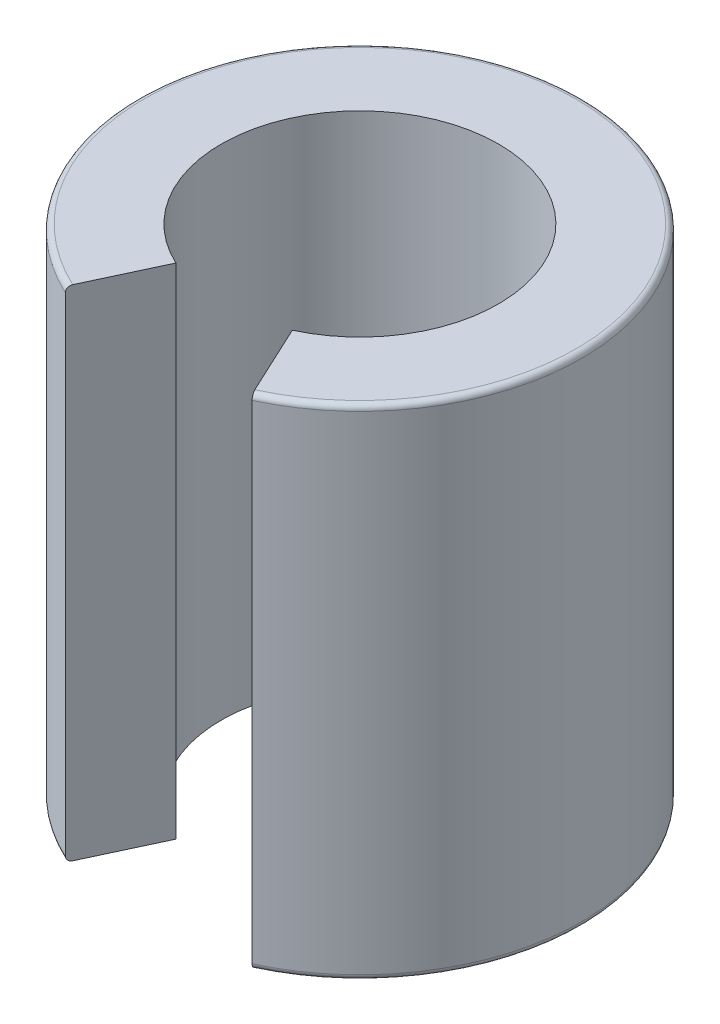
ISO-10303-21;
HEADER;
FILE_DESCRIPTION(('STEP AP214'),'2;1');
FILE_NAME('part.step','',(''),(''),'','','');
FILE_SCHEMA(('AUTOMOTIVE_DESIGN { 1 0 10303 214 1 1 1 1 }'));
ENDSEC;
DATA;
#1=APPLICATION_CONTEXT('core data for automotive mechanical design processes');
#2=APPLICATION_PROTOCOL_DEFINITION('international standard','automotive_design',2000,#1);
#3=PRODUCT_CONTEXT('',#1,'mechanical');
#4=PRODUCT('Part','Part','',(#3));
#5=PRODUCT_RELATED_PRODUCT_CATEGORY('part','',(#4));
#6=PRODUCT_DEFINITION_FORMATION('','',#4);
#7=PRODUCT_DEFINITION_CONTEXT('part definition',#1,'design');
#8=PRODUCT_DEFINITION('design','',#6,#7);
#9=PRODUCT_DEFINITION_SHAPE('','',#8);
#10=(LENGTH_UNIT() NAMED_UNIT(*) SI_UNIT(.MILLI.,.METRE.));
#11=(NAMED_UNIT(*) PLANE_ANGLE_UNIT() SI_UNIT($,.RADIAN.));
#12=(NAMED_UNIT(*) SI_UNIT($,.STERADIAN.) SOLID_ANGLE_UNIT());
#13=UNCERTAINTY_MEASURE_WITH_UNIT(LENGTH_MEASURE(1.E-05),#10,'distance_accuracy_value','');
#14=(GEOMETRIC_REPRESENTATION_CONTEXT(3) GLOBAL_UNCERTAINTY_ASSIGNED_CONTEXT((#13)) GLOBAL_UNIT_ASSIGNED_CONTEXT((#10,
#11,#12)) REPRESENTATION_CONTEXT('',''));
#15=CARTESIAN_POINT('',(0.,0.,0.));
#16=DIRECTION('',(0.,0.,1.));
#17=DIRECTION('',(1.,0.,0.));
#18=AXIS2_PLACEMENT_3D('',#15,#16,#17);
#19=CARTESIAN_POINT('',(0.,90.,0.));
#20=DIRECTION('',(0.,-1.,0.));
#21=DIRECTION('',(0.,0.,-1.));
#22=AXIS2_PLACEMENT_3D('',#19,#20,#21);
#23=CYLINDRICAL_SURFACE('',#22,40.);
#24=DIRECTION('',(0.,-1.,0.));
#25=VECTOR('',#24,1.);
#26=CARTESIAN_POINT('',(16.8392904374229,90.,36.2827548232506));
#27=LINE('',#26,#25);
#28=CARTESIAN_POINT('',(16.8392904374229,89.,36.2827548232506));
#29=VERTEX_POINT('',#28);
#30=CARTESIAN_POINT('',(16.8392904374229,1.00000000000003,36.2827548232506));
#31=VERTEX_POINT('',#30);
#32=EDGE_CURVE('E114',#29,#31,#27,.T.);
#33=ORIENTED_EDGE('',*,*,#32,.T.);
#34=CARTESIAN_POINT('',(0.,1.,0.));
#35=DIRECTION('',(0.,1.,0.));
#36=DIRECTION('',(0.,0.,1.));
#37=AXIS2_PLACEMENT_3D('',#34,#35,#36);
#38=CIRCLE('',#37,40.);
#39=CARTESIAN_POINT('',(-16.8392904374229,1.00000000000003,36.2827548232506));
#40=VERTEX_POINT('',#39);
#41=EDGE_CURVE('E127',#31,#40,#38,.T.);
#42=ORIENTED_EDGE('',*,*,#41,.T.);
#43=DIRECTION('',(0.,-1.,0.));
#44=VECTOR('',#43,1.);
#45=CARTESIAN_POINT('',(-16.8392904374229,90.,36.2827548232506));
#46=LINE('',#45,#44);
#47=CARTESIAN_POINT('',(-16.8392904374229,89.,36.2827548232506));
#48=VERTEX_POINT('',#47);
#49=EDGE_CURVE('E107',#48,#40,#46,.T.);
#50=ORIENTED_EDGE('',*,*,#49,.F.);
#51=CARTESIAN_POINT('',(0.,89.,0.));
#52=DIRECTION('',(0.,1.,0.));
#53=DIRECTION('',(0.,0.,1.));
#54=AXIS2_PLACEMENT_3D('',#51,#52,#53);
#55=CIRCLE('',#54,40.);
#56=EDGE_CURVE('E125',#48,#29,#55,.F.);
#57=ORIENTED_EDGE('',*,*,#56,.T.);
#58=EDGE_LOOP('',(#33,#42,#50,#57));
#59=FACE_BOUND('',#58,.T.);
#60=ADVANCED_FACE('F33',(#59),#23,.T.);
#61=CARTESIAN_POINT('',(-16.8392904374229,90.,36.2827548232506));
#62=DIRECTION('',(-0.906307787036653,0.,-0.422618261740694));
#63=DIRECTION('',(-0.422618261740694,0.,0.906307787036653));
#64=AXIS2_PLACEMENT_3D('',#61,#62,#63);
#65=PLANE('',#64);
#66=ORIENTED_EDGE('',*,*,#49,.T.);
#67=CARTESIAN_POINT('',(-16.8392904374229,1.,36.2827548232506));
#68=CARTESIAN_POINT('',(-16.8392903583495,0.971865281964026,36.2827546536771));
#69=CARTESIAN_POINT('',(-16.8387883287328,0.943744042662502,36.2816780476897));
#70=CARTESIAN_POINT('',(-16.8367855283459,0.887702795575699,36.2773830283998));
#71=CARTESIAN_POINT('',(-16.8352848054865,0.859782778202065,36.274164717842));
#72=CARTESIAN_POINT('',(-16.8292988521656,0.776673362041052,36.2613277995194));
#73=CARTESIAN_POINT('',(-16.8233297974199,0.722040665894178,36.2485271203084));
#74=CARTESIAN_POINT('',(-16.8076003399727,0.615923482864628,36.2147951899571));
#75=CARTESIAN_POINT('',(-16.7978381173006,0.564440520977031,36.1938600358771));
#76=CARTESIAN_POINT('',(-16.7748004575017,0.466084859272368,36.144455615006));
#77=CARTESIAN_POINT('',(-16.7615256393142,0.419211349237696,36.1159876755344));
#78=CARTESIAN_POINT('',(-16.7318394129019,0.33140496286243,36.0523253575495));
#79=CARTESIAN_POINT('',(-16.7154280330146,0.290472032857483,36.0171310398059));
#80=CARTESIAN_POINT('',(-16.6799300602223,0.215697828160231,35.9410053914889));
#81=CARTESIAN_POINT('',(-16.6608429446017,0.181857942353465,35.900072939948));
#82=CARTESIAN_POINT('',(-16.6205367285314,0.122236430522117,35.8136359806456));
#83=CARTESIAN_POINT('',(-16.599317208406,0.0964563948662476,35.7681305728868));
#84=CARTESIAN_POINT('',(-16.5553543799109,0.0537050293593094,35.6738519829338));
#85=CARTESIAN_POINT('',(-16.5326119729355,0.0367285398403558,35.625080733786));
#86=CARTESIAN_POINT('',(-16.49422057845,0.0162850986335539,35.5427501226239));
#87=CARTESIAN_POINT('',(-16.4788130977516,0.0101818776026755,35.5097086736387));
#88=CARTESIAN_POINT('',(-16.4478297211884,0.00203986617908307,35.443264608178));
#89=CARTESIAN_POINT('',(-16.4322540956502,-4.68548731953974E-06,35.40986257142));
#90=CARTESIAN_POINT('',(-16.4166714700718,0.,35.3764455230275));
#91=B_SPLINE_CURVE_WITH_KNOTS('',3,(#67,#68,#69,#70,#71,#72,#73,#74,#75,#76,#77,#78,#79,#80,#81,
#82,#83,#84,#85,#86,#87,#88,#89,#90),.UNSPECIFIED.,.F.,.F.,(4,2,2,2,2,2,2,2,2,2,2,4),(0.,
0.0843523107374993,0.168700575099574,0.337118890606036,0.505618113586534,0.674087665798432,
0.842555696042398,1.01105668317665,1.17959089795246,1.34802622460216,1.45870945942342,
1.56923546692728),.UNSPECIFIED.);
#92=CARTESIAN_POINT('',(-16.4166714700718,0.,35.3764455230275));
#93=VERTEX_POINT('',#92);
#94=EDGE_CURVE('E136',#40,#93,#91,.T.);
#95=ORIENTED_EDGE('',*,*,#94,.T.);
#96=DIRECTION('',(0.422618261740694,0.,-0.906307787036653));
#97=VECTOR('',#96,1.);
#98=CARTESIAN_POINT('',(-16.8392904374229,0.,36.2827548232506));
#99=LINE('',#98,#97);
#100=CARTESIAN_POINT('',(-10.5,0.,22.6881026090769));
#101=VERTEX_POINT('',#100);
#102=EDGE_CURVE('E104',#93,#101,#99,.T.);
#103=ORIENTED_EDGE('',*,*,#102,.T.);
#104=DIRECTION('',(0.,-1.,0.));
#105=VECTOR('',#104,1.);
#106=CARTESIAN_POINT('',(-10.5,90.,22.6881026090769));
#107=LINE('',#106,#105);
#108=CARTESIAN_POINT('',(-10.5,90.,22.6881026090769));
#109=VERTEX_POINT('',#108);
#110=EDGE_CURVE('E101',#109,#101,#107,.T.);
#111=ORIENTED_EDGE('',*,*,#110,.F.);
#112=DIRECTION('',(0.422618261740694,0.,-0.906307787036653));
#113=VECTOR('',#112,1.);
#114=CARTESIAN_POINT('',(-16.8392904374229,90.,36.2827548232506));
#115=LINE('',#114,#113);
#116=CARTESIAN_POINT('',(-16.4166714700718,90.,35.3764455230275));
#117=VERTEX_POINT('',#116);
#118=EDGE_CURVE('E90',#117,#109,#115,.T.);
#119=ORIENTED_EDGE('',*,*,#118,.F.);
#120=CARTESIAN_POINT('',(-16.4166714700718,90.,35.3764455230275));
#121=CARTESIAN_POINT('',(-16.428561764379,89.9999998128465,35.4019443414562));
#122=CARTESIAN_POINT('',(-16.4404463623152,89.9988119059018,35.4274309439779));
#123=CARTESIAN_POINT('',(-16.4641305139557,89.9940728614243,35.4782217710774));
#124=CARTESIAN_POINT('',(-16.4759300717117,89.9905218372417,35.503526004344));
#125=CARTESIAN_POINT('',(-16.5110537758336,89.9763578178384,35.5788490309073));
#126=CARTESIAN_POINT('',(-16.5341426488771,89.9622337822076,35.6283632789359));
#127=CARTESIAN_POINT('',(-16.5789898999407,89.925014576032,35.7245385192076));
#128=CARTESIAN_POINT('',(-16.6007476334219,89.9019150987449,35.7711981292327));
#129=CARTESIAN_POINT('',(-16.6423147078754,89.8474031224208,35.8603390080636));
#130=CARTESIAN_POINT('',(-16.6621243913156,89.8159920881544,35.9028210112941));
#131=CARTESIAN_POINT('',(-16.6992330906472,89.7457482155867,35.9824008738219));
#132=CARTESIAN_POINT('',(-16.7165321329837,89.7069154554696,36.0194987898307));
#133=CARTESIAN_POINT('',(-16.7481331346666,89.6229198088431,36.0872673566346));
#134=CARTESIAN_POINT('',(-16.7624345070578,89.5777556855125,36.1179367487004));
#135=CARTESIAN_POINT('',(-16.787631615616,89.4823828556533,36.1719721223802));
#136=CARTESIAN_POINT('',(-16.7985266903081,89.4321731718171,36.1953366854571));
#137=CARTESIAN_POINT('',(-16.8165941063811,89.3281482217713,36.2340823842613));
#138=CARTESIAN_POINT('',(-16.8237686285172,89.2743350886132,36.2494681966336));
#139=CARTESIAN_POINT('',(-16.8324082457995,89.1834938688209,36.2679959156859));
#140=CARTESIAN_POINT('',(-16.8349875078283,89.1470372444654,36.2735271609565));
#141=CARTESIAN_POINT('',(-16.8384283762824,89.0737255082035,36.2809061271688));
#142=CARTESIAN_POINT('',(-16.8392924174639,89.0368710359207,36.2827590694622));
#143=CARTESIAN_POINT('',(-16.8392904374229,89.,36.2827548232506));
#144=B_SPLINE_CURVE_WITH_KNOTS('',3,(#120,#121,#122,#123,#124,#125,#126,#127,#128,#129,#130,
#131,#132,#133,#134,#135,#136,#137,#138,#139,#140,#141,#142,#143),.UNSPECIFIED.,.F.,.F.,(4,2,2,
2,2,2,2,2,2,2,2,4),(0.,0.0843526561477829,0.168701266489357,0.337120288754012,0.505620224567067,
0.674090484883363,0.842558970544301,1.01106041221889,1.17959455517936,1.34802980198864,
1.45871124423416,1.56923546148219),.UNSPECIFIED.);
#145=EDGE_CURVE('E130',#117,#48,#144,.T.);
#146=ORIENTED_EDGE('',*,*,#145,.T.);
#147=EDGE_LOOP('',(#66,#95,#103,#111,#119,#146));
#148=FACE_BOUND('',#147,.T.);
#149=ADVANCED_FACE('F103',(#148),#65,.F.);
#150=CARTESIAN_POINT('',(0.,90.,0.));
#151=DIRECTION('',(0.,-1.,0.));
#152=DIRECTION('',(0.,0.,-1.));
#153=AXIS2_PLACEMENT_3D('',#150,#151,#152);
#154=CYLINDRICAL_SURFACE('',#153,25.);
#155=CARTESIAN_POINT('',(0.,0.,0.));
#156=DIRECTION('',(0.,-1.,0.));
#157=DIRECTION('',(0.,0.,1.));
#158=AXIS2_PLACEMENT_3D('',#155,#156,#157);
#159=CIRCLE('',#158,25.);
#160=CARTESIAN_POINT('',(10.5,0.,22.6881026090769));
#161=VERTEX_POINT('',#160);
#162=EDGE_CURVE('E118',#101,#161,#159,.T.);
#163=ORIENTED_EDGE('',*,*,#162,.T.);
#164=DIRECTION('',(0.,-1.,0.));
#165=VECTOR('',#164,1.);
#166=CARTESIAN_POINT('',(10.5,90.,22.6881026090769));
#167=LINE('',#166,#165);
#168=CARTESIAN_POINT('',(10.5,90.,22.6881026090769));
#169=VERTEX_POINT('',#168);
#170=EDGE_CURVE('E108',#169,#161,#167,.T.);
#171=ORIENTED_EDGE('',*,*,#170,.F.);
#172=CARTESIAN_POINT('',(0.,90.,0.));
#173=DIRECTION('',(0.,-1.,0.));
#174=DIRECTION('',(0.,0.,1.));
#175=AXIS2_PLACEMENT_3D('',#172,#173,#174);
#176=CIRCLE('',#175,25.);
#177=EDGE_CURVE('E94',#109,#169,#176,.T.);
#178=ORIENTED_EDGE('',*,*,#177,.F.);
#179=ORIENTED_EDGE('',*,*,#110,.T.);
#180=EDGE_LOOP('',(#163,#171,#178,#179));
#181=FACE_BOUND('',#180,.T.);
#182=ADVANCED_FACE('F110',(#181),#154,.F.);
#183=CARTESIAN_POINT('',(16.8392904374229,90.,36.2827548232506));
#184=DIRECTION('',(0.906307787036652,0.,-0.422618261740694));
#185=DIRECTION('',(-0.422618261740694,0.,-0.906307787036652));
#186=AXIS2_PLACEMENT_3D('',#183,#184,#185);
#187=PLANE('',#186);
#188=DIRECTION('',(0.422618261740694,0.,0.906307787036652));
#189=VECTOR('',#188,1.);
#190=CARTESIAN_POINT('',(16.8392904374229,0.,36.2827548232506));
#191=LINE('',#190,#189);
#192=CARTESIAN_POINT('',(16.4166714700718,0.,35.3764455230275));
#193=VERTEX_POINT('',#192);
#194=EDGE_CURVE('E98',#161,#193,#191,.T.);
#195=ORIENTED_EDGE('',*,*,#194,.T.);
#196=CARTESIAN_POINT('',(16.4166714700718,0.,35.3764455230275));
#197=CARTESIAN_POINT('',(16.428561764379,1.87153543466102E-07,35.4019443414562));
#198=CARTESIAN_POINT('',(16.4404463623152,0.00118809409813933,35.4274309439778));
#199=CARTESIAN_POINT('',(16.4641305139557,0.00592713857568742,35.4782217710774));
#200=CARTESIAN_POINT('',(16.4759300717117,0.00947816275828511,35.503526004344));
#201=CARTESIAN_POINT('',(16.5110537758336,0.0236421821616079,35.5788490309073));
#202=CARTESIAN_POINT('',(16.5341426488771,0.037766217792391,35.6283632789359));
#203=CARTESIAN_POINT('',(16.5789898999407,0.0749854239680097,35.7245385192076));
#204=CARTESIAN_POINT('',(16.6007476334219,0.0980849012550499,35.7711981292327));
#205=CARTESIAN_POINT('',(16.6423147078755,0.152596877579198,35.8603390080636));
#206=CARTESIAN_POINT('',(16.6621243913156,0.184007911845568,35.9028210112941));
#207=CARTESIAN_POINT('',(16.6992330906472,0.254251784413312,35.9824008738218));
#208=CARTESIAN_POINT('',(16.7165321329837,0.293084544530373,36.0194987898307));
#209=CARTESIAN_POINT('',(16.7481331346666,0.377080191156901,36.0872673566346));
#210=CARTESIAN_POINT('',(16.7624345070578,0.422244314487487,36.1179367487004));
#211=CARTESIAN_POINT('',(16.787631615616,0.517617144346736,36.1719721223802));
#212=CARTESIAN_POINT('',(16.7985266903082,0.567826828182934,36.1953366854571));
#213=CARTESIAN_POINT('',(16.8165941063811,0.67185177822872,36.2340823842613));
#214=CARTESIAN_POINT('',(16.8237686285173,0.725664911386784,36.2494681966336));
#215=CARTESIAN_POINT('',(16.8324082457995,0.816506131179097,36.2679959156858));
#216=CARTESIAN_POINT('',(16.8349875078283,0.852962755534643,36.2735271609565));
#217=CARTESIAN_POINT('',(16.8384283762824,0.926274491796528,36.2809061271687));
#218=CARTESIAN_POINT('',(16.8392924174639,0.963128964079274,36.2827590694622));
#219=CARTESIAN_POINT('',(16.8392904374229,1.,36.2827548232506));
#220=B_SPLINE_CURVE_WITH_KNOTS('',3,(#196,#197,#198,#199,#200,#201,#202,#203,#204,#205,#206,
#207,#208,#209,#210,#211,#212,#213,#214,#215,#216,#217,#218,#219),.UNSPECIFIED.,.F.,.F.,(4,2,2,
2,2,2,2,2,2,2,2,4),(0.,0.0843526561477751,0.168701266489349,0.337120288754003,0.505620224567056,
0.674090484883348,0.842558970544294,1.01106041221888,1.17959455517934,1.34802980198862,
1.45871124423416,1.56923546148218),.UNSPECIFIED.);
#221=EDGE_CURVE('E42',#193,#31,#220,.T.);
#222=ORIENTED_EDGE('',*,*,#221,.T.);
#223=ORIENTED_EDGE('',*,*,#32,.F.);
#224=CARTESIAN_POINT('',(16.8392904374229,89.,36.2827548232506));
#225=CARTESIAN_POINT('',(16.8392903583495,89.028134718036,36.282754653677));
#226=CARTESIAN_POINT('',(16.8387883287328,89.0562559573375,36.2816780476897));
#227=CARTESIAN_POINT('',(16.8367855283459,89.1122972044243,36.2773830283998));
#228=CARTESIAN_POINT('',(16.8352848054865,89.1402172217979,36.2741647178419));
#229=CARTESIAN_POINT('',(16.8292988521656,89.2233266379589,36.2613277995194));
#230=CARTESIAN_POINT('',(16.8233297974199,89.2779593341058,36.2485271203084));
#231=CARTESIAN_POINT('',(16.8076003399727,89.3840765171354,36.214795189957));
#232=CARTESIAN_POINT('',(16.7978381173006,89.435559479023,36.1938600358771));
#233=CARTESIAN_POINT('',(16.7748004575017,89.5339151407276,36.144455615006));
#234=CARTESIAN_POINT('',(16.7615256393142,89.5807886507623,36.1159876755343));
#235=CARTESIAN_POINT('',(16.731839412902,89.6685950371376,36.0523253575495));
#236=CARTESIAN_POINT('',(16.7154280330146,89.7095279671425,36.0171310398059));
#237=CARTESIAN_POINT('',(16.6799300602223,89.7843021718398,35.9410053914889));
#238=CARTESIAN_POINT('',(16.6608429446017,89.8181420576465,35.900072939948));
#239=CARTESIAN_POINT('',(16.6205367285314,89.8777635694779,35.8136359806456));
#240=CARTESIAN_POINT('',(16.599317208406,89.9035436051337,35.7681305728868));
#241=CARTESIAN_POINT('',(16.5553543799109,89.9462949706407,35.6738519829338));
#242=CARTESIAN_POINT('',(16.5326119729355,89.9632714601596,35.625080733786));
#243=CARTESIAN_POINT('',(16.49422057845,89.9837149013664,35.542750122624));
#244=CARTESIAN_POINT('',(16.4788130977517,89.9898181223973,35.5097086736387));
#245=CARTESIAN_POINT('',(16.4478297211884,89.9979601338209,35.443264608178));
#246=CARTESIAN_POINT('',(16.4322540956502,90.0000046854873,35.40986257142));
#247=CARTESIAN_POINT('',(16.4166714700718,90.,35.3764455230275));
#248=B_SPLINE_CURVE_WITH_KNOTS('',3,(#224,#225,#226,#227,#228,#229,#230,#231,#232,#233,#234,
#235,#236,#237,#238,#239,#240,#241,#242,#243,#244,#245,#246,#247),.UNSPECIFIED.,.F.,.F.,(4,2,2,
2,2,2,2,2,2,2,2,4),(0.,0.0843523107375016,0.168700575099573,0.337118890606038,0.505618113586521,
0.674087665798451,0.842555696042419,1.01105668317666,1.17959089795246,1.34802622460216,
1.4587094594234,1.56923546692728),.UNSPECIFIED.);
#249=CARTESIAN_POINT('',(16.4166714700718,90.,35.3764455230275));
#250=VERTEX_POINT('',#249);
#251=EDGE_CURVE('E49',#29,#250,#248,.T.);
#252=ORIENTED_EDGE('',*,*,#251,.T.);
#253=DIRECTION('',(0.422618261740694,0.,0.906307787036652));
#254=VECTOR('',#253,1.);
#255=CARTESIAN_POINT('',(16.8392904374229,90.,36.2827548232506));
#256=LINE('',#255,#254);
#257=EDGE_CURVE('E112',#169,#250,#256,.T.);
#258=ORIENTED_EDGE('',*,*,#257,.F.);
#259=ORIENTED_EDGE('',*,*,#170,.T.);
#260=EDGE_LOOP('',(#195,#222,#223,#252,#258,#259));
#261=FACE_BOUND('',#260,.T.);
#262=ADVANCED_FACE('F162',(#261),#187,.F.);
#263=CARTESIAN_POINT('',(0.,90.,0.));
#264=DIRECTION('',(0.,1.,0.));
#265=DIRECTION('',(0.,0.,1.));
#266=AXIS2_PLACEMENT_3D('',#263,#264,#265);
#267=PLANE('',#266);
#268=ORIENTED_EDGE('',*,*,#257,.T.);
#269=CARTESIAN_POINT('',(0.,90.,0.));
#270=DIRECTION('',(0.,1.,0.));
#271=DIRECTION('',(0.,0.,1.));
#272=AXIS2_PLACEMENT_3D('',#269,#270,#271);
#273=CIRCLE('',#272,39.);
#274=EDGE_CURVE('E11',#250,#117,#273,.T.);
#275=ORIENTED_EDGE('',*,*,#274,.T.);
#276=ORIENTED_EDGE('',*,*,#118,.T.);
#277=ORIENTED_EDGE('',*,*,#177,.T.);
#278=EDGE_LOOP('',(#268,#275,#276,#277));
#279=FACE_BOUND('',#278,.T.);
#280=ADVANCED_FACE('F92',(#279),#267,.T.);
#281=CARTESIAN_POINT('',(0.,0.,0.));
#282=DIRECTION('',(0.,1.,0.));
#283=DIRECTION('',(0.,0.,1.));
#284=AXIS2_PLACEMENT_3D('',#281,#282,#283);
#285=PLANE('',#284);
#286=ORIENTED_EDGE('',*,*,#102,.F.);
#287=CARTESIAN_POINT('',(0.,0.,0.));
#288=DIRECTION('',(0.,1.,0.));
#289=DIRECTION('',(0.,0.,1.));
#290=AXIS2_PLACEMENT_3D('',#287,#288,#289);
#291=CIRCLE('',#290,39.);
#292=EDGE_CURVE('E57',#93,#193,#291,.F.);
#293=ORIENTED_EDGE('',*,*,#292,.T.);
#294=ORIENTED_EDGE('',*,*,#194,.F.);
#295=ORIENTED_EDGE('',*,*,#162,.F.);
#296=EDGE_LOOP('',(#286,#293,#294,#295));
#297=FACE_BOUND('',#296,.T.);
#298=ADVANCED_FACE('F152',(#297),#285,.F.);
#299=CARTESIAN_POINT('',(0.,1.,0.));
#300=DIRECTION('',(0.,1.,0.));
#301=DIRECTION('',(0.,0.,1.));
#302=AXIS2_PLACEMENT_3D('',#299,#300,#301);
#303=TOROIDAL_SURFACE('',#302,39.,1.);
#304=ORIENTED_EDGE('',*,*,#221,.F.);
#305=ORIENTED_EDGE('',*,*,#292,.F.);
#306=ORIENTED_EDGE('',*,*,#94,.F.);
#307=ORIENTED_EDGE('',*,*,#41,.F.);
#308=EDGE_LOOP('',(#304,#305,#306,#307));
#309=FACE_BOUND('',#308,.T.);
#310=ADVANCED_FACE('F149',(#309),#303,.T.);
#311=CARTESIAN_POINT('',(0.,89.,0.));
#312=DIRECTION('',(0.,1.,0.));
#313=DIRECTION('',(0.,0.,1.));
#314=AXIS2_PLACEMENT_3D('',#311,#312,#313);
#315=TOROIDAL_SURFACE('',#314,39.,1.);
#316=ORIENTED_EDGE('',*,*,#251,.F.);
#317=ORIENTED_EDGE('',*,*,#56,.F.);
#318=ORIENTED_EDGE('',*,*,#145,.F.);
#319=ORIENTED_EDGE('',*,*,#274,.F.);
#320=EDGE_LOOP('',(#316,#317,#318,#319));
#321=FACE_BOUND('',#320,.T.);
#322=ADVANCED_FACE('F35',(#321),#315,.T.);
#323=CLOSED_SHELL('',(#60,#149,#182,#262,#280,#298,#310,#322));
#324=MANIFOLD_SOLID_BREP('B2',#323);
#325=ADVANCED_BREP_SHAPE_REPRESENTATION('',(#18,#324),#14);
#326=SHAPE_DEFINITION_REPRESENTATION(#9,#325);
ENDSEC;
END-ISO-10303-21;
